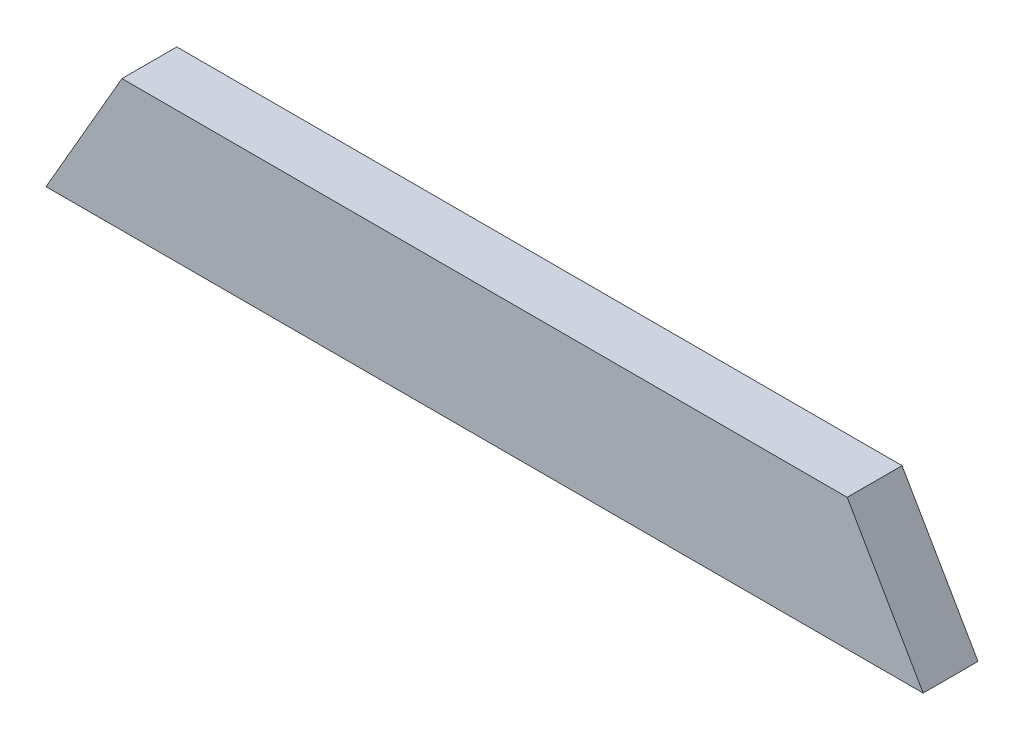
ISO-10303-21;
HEADER;
FILE_DESCRIPTION(('STEP AP214'),'2;1');
FILE_NAME('part.step','',(''),(''),'','','');
FILE_SCHEMA(('AUTOMOTIVE_DESIGN { 1 0 10303 214 1 1 1 1 }'));
ENDSEC;
DATA;
#1=APPLICATION_CONTEXT('core data for automotive mechanical design processes');
#2=APPLICATION_PROTOCOL_DEFINITION('international standard','automotive_design',2000,#1);
#3=PRODUCT_CONTEXT('',#1,'mechanical');
#4=PRODUCT('Part','Part','',(#3));
#5=PRODUCT_RELATED_PRODUCT_CATEGORY('part','',(#4));
#6=PRODUCT_DEFINITION_FORMATION('','',#4);
#7=PRODUCT_DEFINITION_CONTEXT('part definition',#1,'design');
#8=PRODUCT_DEFINITION('design','',#6,#7);
#9=PRODUCT_DEFINITION_SHAPE('','',#8);
#10=(LENGTH_UNIT() NAMED_UNIT(*) SI_UNIT(.MILLI.,.METRE.));
#11=(NAMED_UNIT(*) PLANE_ANGLE_UNIT() SI_UNIT($,.RADIAN.));
#12=(NAMED_UNIT(*) SI_UNIT($,.STERADIAN.) SOLID_ANGLE_UNIT());
#13=UNCERTAINTY_MEASURE_WITH_UNIT(LENGTH_MEASURE(1.E-05),#10,'distance_accuracy_value','');
#14=(GEOMETRIC_REPRESENTATION_CONTEXT(3) GLOBAL_UNCERTAINTY_ASSIGNED_CONTEXT((#13)) GLOBAL_UNIT_ASSIGNED_CONTEXT((#10,
#11,#12)) REPRESENTATION_CONTEXT('',''));
#15=CARTESIAN_POINT('',(0.,0.,0.));
#16=DIRECTION('',(0.,0.,1.));
#17=DIRECTION('',(1.,0.,0.));
#18=AXIS2_PLACEMENT_3D('',#15,#16,#17);
#19=CARTESIAN_POINT('',(200.,0.,25.));
#20=DIRECTION('',(-0.866025403784437,-0.500000000000003,0.));
#21=DIRECTION('',(0.500000000000003,-0.866025403784437,0.));
#22=AXIS2_PLACEMENT_3D('',#19,#20,#21);
#23=PLANE('',#22);
#24=DIRECTION('',(-0.500000000000003,0.866025403784437,0.));
#25=VECTOR('',#24,1.);
#26=CARTESIAN_POINT('',(200.,0.,0.));
#27=LINE('',#26,#25);
#28=CARTESIAN_POINT('',(200.,0.,0.));
#29=VERTEX_POINT('',#28);
#30=CARTESIAN_POINT('',(165.358983848622,60.,0.));
#31=VERTEX_POINT('',#30);
#32=EDGE_CURVE('E98',#29,#31,#27,.T.);
#33=ORIENTED_EDGE('',*,*,#32,.T.);
#34=DIRECTION('',(0.,0.,-1.));
#35=VECTOR('',#34,1.);
#36=CARTESIAN_POINT('',(165.358983848622,60.,25.));
#37=LINE('',#36,#35);
#38=CARTESIAN_POINT('',(165.358983848622,60.,25.));
#39=VERTEX_POINT('',#38);
#40=EDGE_CURVE('E11',#39,#31,#37,.T.);
#41=ORIENTED_EDGE('',*,*,#40,.F.);
#42=DIRECTION('',(-0.500000000000003,0.866025403784437,0.));
#43=VECTOR('',#42,1.);
#44=CARTESIAN_POINT('',(200.,0.,25.));
#45=LINE('',#44,#43);
#46=CARTESIAN_POINT('',(200.,0.,25.));
#47=VERTEX_POINT('',#46);
#48=EDGE_CURVE('E86',#47,#39,#45,.T.);
#49=ORIENTED_EDGE('',*,*,#48,.F.);
#50=DIRECTION('',(0.,0.,-1.));
#51=VECTOR('',#50,1.);
#52=CARTESIAN_POINT('',(200.,0.,25.));
#53=LINE('',#52,#51);
#54=EDGE_CURVE('E94',#47,#29,#53,.T.);
#55=ORIENTED_EDGE('',*,*,#54,.T.);
#56=EDGE_LOOP('',(#33,#41,#49,#55));
#57=FACE_BOUND('',#56,.T.);
#58=ADVANCED_FACE('F35',(#57),#23,.F.);
#59=CARTESIAN_POINT('',(165.358983848622,60.,25.));
#60=DIRECTION('',(0.,-1.,0.));
#61=DIRECTION('',(1.,0.,0.));
#62=AXIS2_PLACEMENT_3D('',#59,#60,#61);
#63=PLANE('',#62);
#64=DIRECTION('',(-1.,0.,0.));
#65=VECTOR('',#64,1.);
#66=CARTESIAN_POINT('',(165.358983848622,60.,0.));
#67=LINE('',#66,#65);
#68=CARTESIAN_POINT('',(-165.358983848622,59.9999999999999,0.));
#69=VERTEX_POINT('',#68);
#70=EDGE_CURVE('E90',#31,#69,#67,.T.);
#71=ORIENTED_EDGE('',*,*,#70,.T.);
#72=DIRECTION('',(0.,0.,-1.));
#73=VECTOR('',#72,1.);
#74=CARTESIAN_POINT('',(-165.358983848622,59.9999999999999,25.));
#75=LINE('',#74,#73);
#76=CARTESIAN_POINT('',(-165.358983848622,59.9999999999999,25.));
#77=VERTEX_POINT('',#76);
#78=EDGE_CURVE('E43',#77,#69,#75,.T.);
#79=ORIENTED_EDGE('',*,*,#78,.F.);
#80=DIRECTION('',(-1.,0.,0.));
#81=VECTOR('',#80,1.);
#82=CARTESIAN_POINT('',(165.358983848622,60.,25.));
#83=LINE('',#82,#81);
#84=EDGE_CURVE('E81',#39,#77,#83,.T.);
#85=ORIENTED_EDGE('',*,*,#84,.F.);
#86=ORIENTED_EDGE('',*,*,#40,.T.);
#87=EDGE_LOOP('',(#71,#79,#85,#86));
#88=FACE_BOUND('',#87,.T.);
#89=ADVANCED_FACE('F89',(#88),#63,.F.);
#90=CARTESIAN_POINT('',(-200.,0.,25.));
#91=DIRECTION('',(0.866025403784437,-0.500000000000003,0.));
#92=DIRECTION('',(0.500000000000003,0.866025403784437,0.));
#93=AXIS2_PLACEMENT_3D('',#90,#91,#92);
#94=PLANE('',#93);
#95=DIRECTION('',(-0.500000000000003,-0.866025403784437,0.));
#96=VECTOR('',#95,1.);
#97=CARTESIAN_POINT('',(-200.,0.,0.));
#98=LINE('',#97,#96);
#99=CARTESIAN_POINT('',(-200.,0.,0.));
#100=VERTEX_POINT('',#99);
#101=EDGE_CURVE('E68',#69,#100,#98,.T.);
#102=ORIENTED_EDGE('',*,*,#101,.T.);
#103=DIRECTION('',(0.,0.,-1.));
#104=VECTOR('',#103,1.);
#105=CARTESIAN_POINT('',(-200.,0.,25.));
#106=LINE('',#105,#104);
#107=CARTESIAN_POINT('',(-200.,0.,25.));
#108=VERTEX_POINT('',#107);
#109=EDGE_CURVE('E91',#108,#100,#106,.T.);
#110=ORIENTED_EDGE('',*,*,#109,.F.);
#111=DIRECTION('',(-0.500000000000003,-0.866025403784437,0.));
#112=VECTOR('',#111,1.);
#113=CARTESIAN_POINT('',(-200.,0.,25.));
#114=LINE('',#113,#112);
#115=EDGE_CURVE('E84',#77,#108,#114,.T.);
#116=ORIENTED_EDGE('',*,*,#115,.F.);
#117=ORIENTED_EDGE('',*,*,#78,.T.);
#118=EDGE_LOOP('',(#102,#110,#116,#117));
#119=FACE_BOUND('',#118,.T.);
#120=ADVANCED_FACE('F92',(#119),#94,.F.);
#121=CARTESIAN_POINT('',(-200.,0.,25.));
#122=DIRECTION('',(0.,1.,0.));
#123=DIRECTION('',(-1.,0.,0.));
#124=AXIS2_PLACEMENT_3D('',#121,#122,#123);
#125=PLANE('',#124);
#126=DIRECTION('',(1.,0.,0.));
#127=VECTOR('',#126,1.);
#128=CARTESIAN_POINT('',(-200.,0.,0.));
#129=LINE('',#128,#127);
#130=EDGE_CURVE('E74',#100,#29,#129,.T.);
#131=ORIENTED_EDGE('',*,*,#130,.T.);
#132=ORIENTED_EDGE('',*,*,#54,.F.);
#133=DIRECTION('',(1.,0.,0.));
#134=VECTOR('',#133,1.);
#135=CARTESIAN_POINT('',(-200.,0.,25.));
#136=LINE('',#135,#134);
#137=EDGE_CURVE('E51',#108,#47,#136,.T.);
#138=ORIENTED_EDGE('',*,*,#137,.F.);
#139=ORIENTED_EDGE('',*,*,#109,.T.);
#140=EDGE_LOOP('',(#131,#132,#138,#139));
#141=FACE_BOUND('',#140,.T.);
#142=ADVANCED_FACE('F105',(#141),#125,.F.);
#143=CARTESIAN_POINT('',(0.,0.,25.));
#144=DIRECTION('',(0.,0.,1.));
#145=DIRECTION('',(1.,0.,0.));
#146=AXIS2_PLACEMENT_3D('',#143,#144,#145);
#147=PLANE('',#146);
#148=ORIENTED_EDGE('',*,*,#48,.T.);
#149=ORIENTED_EDGE('',*,*,#84,.T.);
#150=ORIENTED_EDGE('',*,*,#115,.T.);
#151=ORIENTED_EDGE('',*,*,#137,.T.);
#152=EDGE_LOOP('',(#148,#149,#150,#151));
#153=FACE_BOUND('',#152,.T.);
#154=ADVANCED_FACE('F82',(#153),#147,.T.);
#155=CARTESIAN_POINT('',(0.,0.,0.));
#156=DIRECTION('',(0.,0.,1.));
#157=DIRECTION('',(1.,0.,0.));
#158=AXIS2_PLACEMENT_3D('',#155,#156,#157);
#159=PLANE('',#158);
#160=ORIENTED_EDGE('',*,*,#32,.F.);
#161=ORIENTED_EDGE('',*,*,#130,.F.);
#162=ORIENTED_EDGE('',*,*,#101,.F.);
#163=ORIENTED_EDGE('',*,*,#70,.F.);
#164=EDGE_LOOP('',(#160,#161,#162,#163));
#165=FACE_BOUND('',#164,.T.);
#166=ADVANCED_FACE('F108',(#165),#159,.F.);
#167=CLOSED_SHELL('',(#58,#89,#120,#142,#154,#166));
#168=MANIFOLD_SOLID_BREP('B2',#167);
#169=ADVANCED_BREP_SHAPE_REPRESENTATION('',(#18,#168),#14);
#170=SHAPE_DEFINITION_REPRESENTATION(#9,#169);
ENDSEC;
END-ISO-10303-21;
